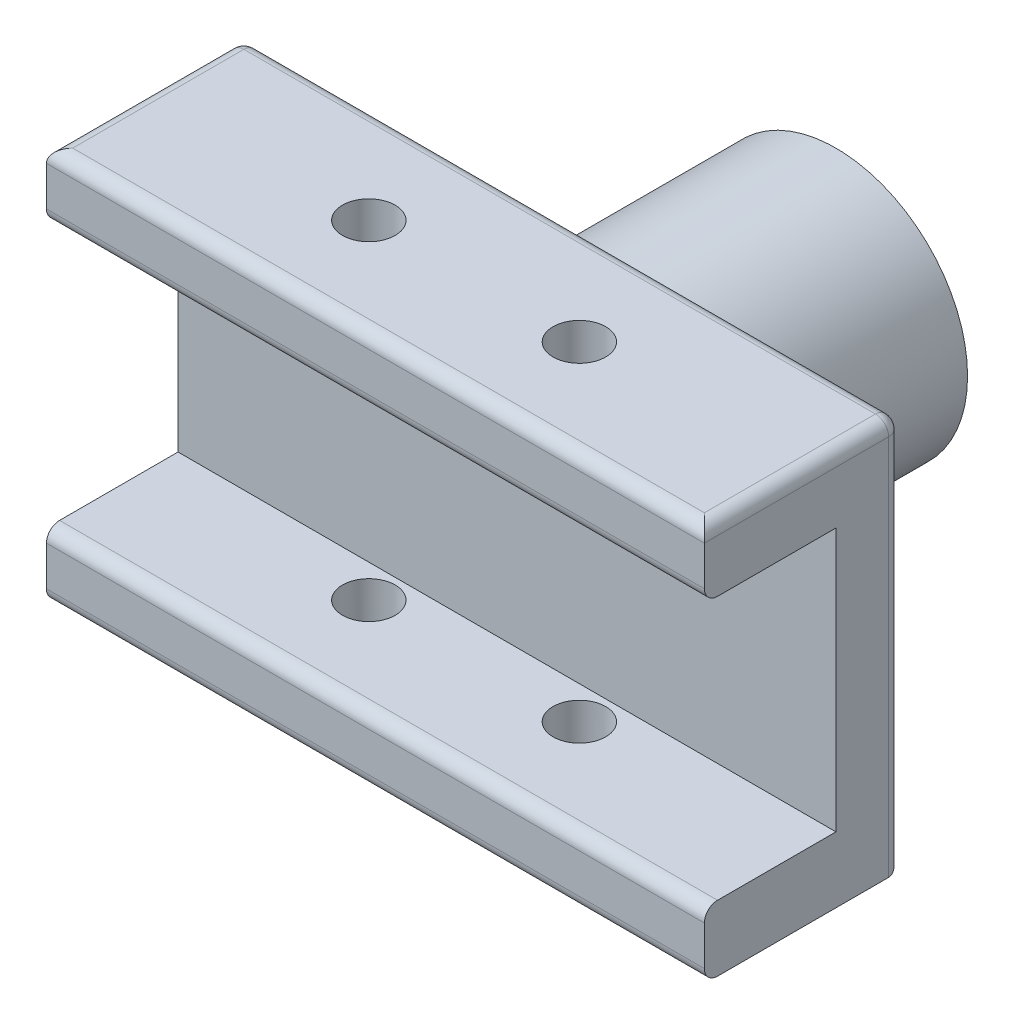
ISO-10303-21;
HEADER;
FILE_DESCRIPTION(('STEP AP214'),'2;1');
FILE_NAME('part.step','',(''),(''),'','','');
FILE_SCHEMA(('AUTOMOTIVE_DESIGN { 1 0 10303 214 1 1 1 1 }'));
ENDSEC;
DATA;
#1=APPLICATION_CONTEXT('core data for automotive mechanical design processes');
#2=APPLICATION_PROTOCOL_DEFINITION('international standard','automotive_design',2000,#1);
#3=PRODUCT_CONTEXT('',#1,'mechanical');
#4=PRODUCT('Part','Part','',(#3));
#5=PRODUCT_RELATED_PRODUCT_CATEGORY('part','',(#4));
#6=PRODUCT_DEFINITION_FORMATION('','',#4);
#7=PRODUCT_DEFINITION_CONTEXT('part definition',#1,'design');
#8=PRODUCT_DEFINITION('design','',#6,#7);
#9=PRODUCT_DEFINITION_SHAPE('','',#8);
#10=(LENGTH_UNIT() NAMED_UNIT(*) SI_UNIT(.MILLI.,.METRE.));
#11=(NAMED_UNIT(*) PLANE_ANGLE_UNIT() SI_UNIT($,.RADIAN.));
#12=(NAMED_UNIT(*) SI_UNIT($,.STERADIAN.) SOLID_ANGLE_UNIT());
#13=UNCERTAINTY_MEASURE_WITH_UNIT(LENGTH_MEASURE(1.E-05),#10,'distance_accuracy_value','');
#14=(GEOMETRIC_REPRESENTATION_CONTEXT(3) GLOBAL_UNCERTAINTY_ASSIGNED_CONTEXT((#13)) GLOBAL_UNIT_ASSIGNED_CONTEXT((#10,
#11,#12)) REPRESENTATION_CONTEXT('',''));
#15=CARTESIAN_POINT('',(0.,0.,0.));
#16=DIRECTION('',(0.,0.,1.));
#17=DIRECTION('',(1.,0.,0.));
#18=AXIS2_PLACEMENT_3D('',#15,#16,#17);
#19=CARTESIAN_POINT('',(0.,0.,15.));
#20=DIRECTION('',(0.,0.,1.));
#21=DIRECTION('',(1.,0.,0.));
#22=AXIS2_PLACEMENT_3D('',#19,#20,#21);
#23=PLANE('',#22);
#24=DIRECTION('',(0.,-1.,0.));
#25=VECTOR('',#24,1.);
#26=CARTESIAN_POINT('',(-25.,15.,15.));
#27=LINE('',#26,#25);
#28=CARTESIAN_POINT('',(-25.,-11.,15.));
#29=VERTEX_POINT('',#28);
#30=CARTESIAN_POINT('',(-25.,-14.,15.));
#31=VERTEX_POINT('',#30);
#32=EDGE_CURVE('E187',#29,#31,#27,.T.);
#33=ORIENTED_EDGE('',*,*,#32,.T.);
#34=DIRECTION('',(1.,0.,0.));
#35=VECTOR('',#34,1.);
#36=CARTESIAN_POINT('',(25.,-14.,15.));
#37=LINE('',#36,#35);
#38=CARTESIAN_POINT('',(25.,-14.,15.));
#39=VERTEX_POINT('',#38);
#40=EDGE_CURVE('E224',#31,#39,#37,.T.);
#41=ORIENTED_EDGE('',*,*,#40,.T.);
#42=DIRECTION('',(0.,1.,0.));
#43=VECTOR('',#42,1.);
#44=CARTESIAN_POINT('',(25.,15.,15.));
#45=LINE('',#44,#43);
#46=CARTESIAN_POINT('',(25.,-11.,15.));
#47=VERTEX_POINT('',#46);
#48=EDGE_CURVE('E184',#39,#47,#45,.T.);
#49=ORIENTED_EDGE('',*,*,#48,.T.);
#50=DIRECTION('',(1.,0.,0.));
#51=VECTOR('',#50,1.);
#52=CARTESIAN_POINT('',(-25.,-11.,15.));
#53=LINE('',#52,#51);
#54=EDGE_CURVE('E218',#47,#29,#53,.F.);
#55=ORIENTED_EDGE('',*,*,#54,.T.);
#56=EDGE_LOOP('',(#33,#41,#49,#55));
#57=FACE_BOUND('',#56,.T.);
#58=ADVANCED_FACE('F39',(#57),#23,.T.);
#59=CARTESIAN_POINT('',(25.,15.,15.));
#60=DIRECTION('',(-1.,0.,0.));
#61=DIRECTION('',(0.,-1.,0.));
#62=AXIS2_PLACEMENT_3D('',#59,#60,#61);
#63=PLANE('',#62);
#64=CARTESIAN_POINT('',(25.,11.,15.));
#65=VERTEX_POINT('',#64);
#66=CARTESIAN_POINT('',(25.,14.,15.));
#67=VERTEX_POINT('',#66);
#68=EDGE_CURVE('E188',#65,#67,#45,.T.);
#69=ORIENTED_EDGE('',*,*,#68,.F.);
#70=CARTESIAN_POINT('',(25.,11.,14.));
#71=DIRECTION('',(-1.,0.,0.));
#72=DIRECTION('',(0.,-1.,0.));
#73=AXIS2_PLACEMENT_3D('',#70,#71,#72);
#74=CIRCLE('',#73,1.);
#75=CARTESIAN_POINT('',(25.,10.,14.));
#76=VERTEX_POINT('',#75);
#77=EDGE_CURVE('E174',#65,#76,#74,.F.);
#78=ORIENTED_EDGE('',*,*,#77,.T.);
#79=DIRECTION('',(0.,0.,1.));
#80=VECTOR('',#79,1.);
#81=CARTESIAN_POINT('',(25.,10.,5.));
#82=LINE('',#81,#80);
#83=CARTESIAN_POINT('',(25.,10.,5.));
#84=VERTEX_POINT('',#83);
#85=EDGE_CURVE('E153',#84,#76,#82,.T.);
#86=ORIENTED_EDGE('',*,*,#85,.F.);
#87=DIRECTION('',(0.,1.,0.));
#88=VECTOR('',#87,1.);
#89=CARTESIAN_POINT('',(25.,10.,5.));
#90=LINE('',#89,#88);
#91=CARTESIAN_POINT('',(25.,-10.,5.));
#92=VERTEX_POINT('',#91);
#93=EDGE_CURVE('E160',#92,#84,#90,.T.);
#94=ORIENTED_EDGE('',*,*,#93,.F.);
#95=DIRECTION('',(0.,0.,1.));
#96=VECTOR('',#95,1.);
#97=CARTESIAN_POINT('',(25.,-10.,5.));
#98=LINE('',#97,#96);
#99=CARTESIAN_POINT('',(25.,-10.,14.));
#100=VERTEX_POINT('',#99);
#101=EDGE_CURVE('E376',#92,#100,#98,.T.);
#102=ORIENTED_EDGE('',*,*,#101,.T.);
#103=CARTESIAN_POINT('',(25.,-11.,14.));
#104=DIRECTION('',(-1.,0.,0.));
#105=DIRECTION('',(0.,-1.,0.));
#106=AXIS2_PLACEMENT_3D('',#103,#104,#105);
#107=CIRCLE('',#106,1.);
#108=EDGE_CURVE('E214',#100,#47,#107,.F.);
#109=ORIENTED_EDGE('',*,*,#108,.T.);
#110=ORIENTED_EDGE('',*,*,#48,.F.);
#111=CARTESIAN_POINT('',(25.,-14.,14.));
#112=DIRECTION('',(-1.,0.,0.));
#113=DIRECTION('',(0.,-1.,0.));
#114=AXIS2_PLACEMENT_3D('',#111,#112,#113);
#115=CIRCLE('',#114,1.);
#116=CARTESIAN_POINT('',(25.,-15.,14.));
#117=VERTEX_POINT('',#116);
#118=EDGE_CURVE('E228',#39,#117,#115,.F.);
#119=ORIENTED_EDGE('',*,*,#118,.T.);
#120=DIRECTION('',(0.,0.,-1.));
#121=VECTOR('',#120,1.);
#122=CARTESIAN_POINT('',(25.,-15.,15.));
#123=LINE('',#122,#121);
#124=CARTESIAN_POINT('',(25.,-15.,1.));
#125=VERTEX_POINT('',#124);
#126=EDGE_CURVE('E192',#117,#125,#123,.T.);
#127=ORIENTED_EDGE('',*,*,#126,.T.);
#128=DIRECTION('',(0.,1.,0.));
#129=VECTOR('',#128,1.);
#130=CARTESIAN_POINT('',(25.,15.,1.));
#131=LINE('',#130,#129);
#132=CARTESIAN_POINT('',(25.,14.,1.));
#133=VERTEX_POINT('',#132);
#134=EDGE_CURVE('E277',#125,#133,#131,.T.);
#135=ORIENTED_EDGE('',*,*,#134,.T.);
#136=DIRECTION('',(0.,0.,-1.));
#137=VECTOR('',#136,1.);
#138=CARTESIAN_POINT('',(25.,14.,15.));
#139=LINE('',#138,#137);
#140=EDGE_CURVE('E273',#133,#67,#139,.F.);
#141=ORIENTED_EDGE('',*,*,#140,.T.);
#142=EDGE_LOOP('',(#69,#78,#86,#94,#102,#109,#110,#119,#127,#135,#141));
#143=FACE_BOUND('',#142,.T.);
#144=ADVANCED_FACE('F172',(#143),#63,.F.);
#145=CARTESIAN_POINT('',(-25.,15.,15.));
#146=DIRECTION('',(0.,-1.,0.));
#147=DIRECTION('',(0.,0.,-1.));
#148=AXIS2_PLACEMENT_3D('',#145,#146,#147);
#149=PLANE('',#148);
#150=DIRECTION('',(0.,0.,-1.));
#151=VECTOR('',#150,1.);
#152=CARTESIAN_POINT('',(24.,15.,15.));
#153=LINE('',#152,#151);
#154=CARTESIAN_POINT('',(24.,15.,14.));
#155=VERTEX_POINT('',#154);
#156=CARTESIAN_POINT('',(24.,15.,1.));
#157=VERTEX_POINT('',#156);
#158=EDGE_CURVE('E240',#155,#157,#153,.T.);
#159=ORIENTED_EDGE('',*,*,#158,.T.);
#160=DIRECTION('',(-1.,0.,0.));
#161=VECTOR('',#160,1.);
#162=CARTESIAN_POINT('',(-25.,15.,1.));
#163=LINE('',#162,#161);
#164=CARTESIAN_POINT('',(-24.,15.,1.));
#165=VERTEX_POINT('',#164);
#166=EDGE_CURVE('E246',#157,#165,#163,.T.);
#167=ORIENTED_EDGE('',*,*,#166,.T.);
#168=DIRECTION('',(0.,0.,-1.));
#169=VECTOR('',#168,1.);
#170=CARTESIAN_POINT('',(-24.,15.,15.));
#171=LINE('',#170,#169);
#172=CARTESIAN_POINT('',(-24.,15.,14.));
#173=VERTEX_POINT('',#172);
#174=EDGE_CURVE('E243',#165,#173,#171,.F.);
#175=ORIENTED_EDGE('',*,*,#174,.T.);
#176=DIRECTION('',(-1.,0.,0.));
#177=VECTOR('',#176,1.);
#178=CARTESIAN_POINT('',(25.,15.,14.));
#179=LINE('',#178,#177);
#180=EDGE_CURVE('E237',#173,#155,#179,.F.);
#181=ORIENTED_EDGE('',*,*,#180,.T.);
#182=EDGE_LOOP('',(#159,#167,#175,#181));
#183=FACE_BOUND('',#182,.T.);
#184=CARTESIAN_POINT('',(-8.,15.,7.49999999999999));
#185=DIRECTION('',(0.,1.,0.));
#186=DIRECTION('',(0.,0.,1.));
#187=AXIS2_PLACEMENT_3D('',#184,#185,#186);
#188=CIRCLE('',#187,2.);
#189=CARTESIAN_POINT('',(-8.,15.,9.49999999999999));
#190=VERTEX_POINT('',#189);
#191=EDGE_CURVE('E465',#190,#190,#188,.T.);
#192=ORIENTED_EDGE('',*,*,#191,.F.);
#193=EDGE_LOOP('',(#192));
#194=FACE_BOUND('',#193,.T.);
#195=CARTESIAN_POINT('',(8.,15.,7.49999999999999));
#196=DIRECTION('',(0.,1.,0.));
#197=DIRECTION('',(0.,0.,1.));
#198=AXIS2_PLACEMENT_3D('',#195,#196,#197);
#199=CIRCLE('',#198,2.);
#200=CARTESIAN_POINT('',(8.,15.,9.49999999999999));
#201=VERTEX_POINT('',#200);
#202=EDGE_CURVE('E468',#201,#201,#199,.T.);
#203=ORIENTED_EDGE('',*,*,#202,.F.);
#204=EDGE_LOOP('',(#203));
#205=FACE_BOUND('',#204,.T.);
#206=ADVANCED_FACE('F352',(#183,#194,#205),#149,.F.);
#207=CARTESIAN_POINT('',(-25.,15.,15.));
#208=DIRECTION('',(1.,0.,0.));
#209=DIRECTION('',(0.,1.,0.));
#210=AXIS2_PLACEMENT_3D('',#207,#208,#209);
#211=PLANE('',#210);
#212=DIRECTION('',(0.,0.,1.));
#213=VECTOR('',#212,1.);
#214=CARTESIAN_POINT('',(-25.,10.,5.));
#215=LINE('',#214,#213);
#216=CARTESIAN_POINT('',(-25.,10.,5.));
#217=VERTEX_POINT('',#216);
#218=CARTESIAN_POINT('',(-25.,10.,14.));
#219=VERTEX_POINT('',#218);
#220=EDGE_CURVE('E155',#217,#219,#215,.T.);
#221=ORIENTED_EDGE('',*,*,#220,.T.);
#222=CARTESIAN_POINT('',(-25.,11.,14.));
#223=DIRECTION('',(1.,0.,0.));
#224=DIRECTION('',(0.,1.,0.));
#225=AXIS2_PLACEMENT_3D('',#222,#223,#224);
#226=CIRCLE('',#225,1.);
#227=CARTESIAN_POINT('',(-25.,11.,15.));
#228=VERTEX_POINT('',#227);
#229=EDGE_CURVE('E63',#219,#228,#226,.F.);
#230=ORIENTED_EDGE('',*,*,#229,.T.);
#231=CARTESIAN_POINT('',(-25.,14.,15.));
#232=VERTEX_POINT('',#231);
#233=EDGE_CURVE('E189',#232,#228,#27,.T.);
#234=ORIENTED_EDGE('',*,*,#233,.F.);
#235=DIRECTION('',(0.,0.,-1.));
#236=VECTOR('',#235,1.);
#237=CARTESIAN_POINT('',(-25.,14.,15.));
#238=LINE('',#237,#236);
#239=CARTESIAN_POINT('',(-25.,14.,1.));
#240=VERTEX_POINT('',#239);
#241=EDGE_CURVE('E263',#232,#240,#238,.T.);
#242=ORIENTED_EDGE('',*,*,#241,.T.);
#243=DIRECTION('',(0.,-1.,0.));
#244=VECTOR('',#243,1.);
#245=CARTESIAN_POINT('',(-25.,15.,1.));
#246=LINE('',#245,#244);
#247=CARTESIAN_POINT('',(-25.,-15.,1.));
#248=VERTEX_POINT('',#247);
#249=EDGE_CURVE('E266',#240,#248,#246,.T.);
#250=ORIENTED_EDGE('',*,*,#249,.T.);
#251=DIRECTION('',(0.,0.,-1.));
#252=VECTOR('',#251,1.);
#253=CARTESIAN_POINT('',(-25.,-15.,15.));
#254=LINE('',#253,#252);
#255=CARTESIAN_POINT('',(-25.,-15.,14.));
#256=VERTEX_POINT('',#255);
#257=EDGE_CURVE('E196',#256,#248,#254,.T.);
#258=ORIENTED_EDGE('',*,*,#257,.F.);
#259=CARTESIAN_POINT('',(-25.,-14.,14.));
#260=DIRECTION('',(1.,0.,0.));
#261=DIRECTION('',(0.,1.,0.));
#262=AXIS2_PLACEMENT_3D('',#259,#260,#261);
#263=CIRCLE('',#262,1.);
#264=EDGE_CURVE('E234',#256,#31,#263,.F.);
#265=ORIENTED_EDGE('',*,*,#264,.T.);
#266=ORIENTED_EDGE('',*,*,#32,.F.);
#267=CARTESIAN_POINT('',(-25.,-11.,14.));
#268=DIRECTION('',(1.,0.,0.));
#269=DIRECTION('',(0.,1.,0.));
#270=AXIS2_PLACEMENT_3D('',#267,#268,#269);
#271=CIRCLE('',#270,1.);
#272=CARTESIAN_POINT('',(-25.,-10.,14.));
#273=VERTEX_POINT('',#272);
#274=EDGE_CURVE('E221',#29,#273,#271,.F.);
#275=ORIENTED_EDGE('',*,*,#274,.T.);
#276=DIRECTION('',(0.,0.,1.));
#277=VECTOR('',#276,1.);
#278=CARTESIAN_POINT('',(-25.,-10.,5.));
#279=LINE('',#278,#277);
#280=CARTESIAN_POINT('',(-25.,-10.,5.));
#281=VERTEX_POINT('',#280);
#282=EDGE_CURVE('E179',#281,#273,#279,.T.);
#283=ORIENTED_EDGE('',*,*,#282,.F.);
#284=DIRECTION('',(0.,-1.,0.));
#285=VECTOR('',#284,1.);
#286=CARTESIAN_POINT('',(-25.,10.,5.));
#287=LINE('',#286,#285);
#288=EDGE_CURVE('E159',#217,#281,#287,.T.);
#289=ORIENTED_EDGE('',*,*,#288,.F.);
#290=EDGE_LOOP('',(#221,#230,#234,#242,#250,#258,#265,#266,#275,#283,#289));
#291=FACE_BOUND('',#290,.T.);
#292=ADVANCED_FACE('F366',(#291),#211,.F.);
#293=CARTESIAN_POINT('',(-25.,-15.,15.));
#294=DIRECTION('',(0.,1.,0.));
#295=DIRECTION('',(0.,0.,1.));
#296=AXIS2_PLACEMENT_3D('',#293,#294,#295);
#297=PLANE('',#296);
#298=CARTESIAN_POINT('',(-8.,-15.,7.49999999999999));
#299=DIRECTION('',(0.,1.,0.));
#300=DIRECTION('',(0.,0.,1.));
#301=AXIS2_PLACEMENT_3D('',#298,#299,#300);
#302=CIRCLE('',#301,2.);
#303=CARTESIAN_POINT('',(-8.,-15.,9.49999999999999));
#304=VERTEX_POINT('',#303);
#305=EDGE_CURVE('E206',#304,#304,#302,.T.);
#306=ORIENTED_EDGE('',*,*,#305,.T.);
#307=EDGE_LOOP('',(#306));
#308=FACE_BOUND('',#307,.T.);
#309=CARTESIAN_POINT('',(8.,-15.,7.49999999999999));
#310=DIRECTION('',(0.,1.,0.));
#311=DIRECTION('',(0.,0.,1.));
#312=AXIS2_PLACEMENT_3D('',#309,#310,#311);
#313=CIRCLE('',#312,2.);
#314=CARTESIAN_POINT('',(8.,-15.,9.49999999999999));
#315=VERTEX_POINT('',#314);
#316=EDGE_CURVE('E471',#315,#315,#313,.T.);
#317=ORIENTED_EDGE('',*,*,#316,.T.);
#318=EDGE_LOOP('',(#317));
#319=FACE_BOUND('',#318,.T.);
#320=ORIENTED_EDGE('',*,*,#257,.T.);
#321=DIRECTION('',(1.,0.,0.));
#322=VECTOR('',#321,1.);
#323=CARTESIAN_POINT('',(-25.,-15.,1.));
#324=LINE('',#323,#322);
#325=EDGE_CURVE('E270',#248,#125,#324,.T.);
#326=ORIENTED_EDGE('',*,*,#325,.T.);
#327=ORIENTED_EDGE('',*,*,#126,.F.);
#328=DIRECTION('',(1.,0.,0.));
#329=VECTOR('',#328,1.);
#330=CARTESIAN_POINT('',(-25.,-15.,14.));
#331=LINE('',#330,#329);
#332=EDGE_CURVE('E231',#117,#256,#331,.F.);
#333=ORIENTED_EDGE('',*,*,#332,.T.);
#334=EDGE_LOOP('',(#320,#326,#327,#333));
#335=FACE_BOUND('',#334,.T.);
#336=ADVANCED_FACE('F359',(#308,#319,#335),#297,.F.);
#337=ORIENTED_EDGE('',*,*,#233,.T.);
#338=DIRECTION('',(-1.,0.,0.));
#339=VECTOR('',#338,1.);
#340=CARTESIAN_POINT('',(25.,11.,15.));
#341=LINE('',#340,#339);
#342=EDGE_CURVE('E55',#228,#65,#341,.F.);
#343=ORIENTED_EDGE('',*,*,#342,.T.);
#344=ORIENTED_EDGE('',*,*,#68,.T.);
#345=DIRECTION('',(-1.,0.,0.));
#346=VECTOR('',#345,1.);
#347=CARTESIAN_POINT('',(-25.,14.,15.));
#348=LINE('',#347,#346);
#349=EDGE_CURVE('E280',#67,#232,#348,.T.);
#350=ORIENTED_EDGE('',*,*,#349,.T.);
#351=EDGE_LOOP('',(#337,#343,#344,#350));
#352=FACE_BOUND('',#351,.T.);
#353=ADVANCED_FACE('F348',(#352),#23,.T.);
#354=CARTESIAN_POINT('',(0.,0.,0.));
#355=DIRECTION('',(0.,0.,1.));
#356=DIRECTION('',(1.,0.,0.));
#357=AXIS2_PLACEMENT_3D('',#354,#355,#356);
#358=PLANE('',#357);
#359=CARTESIAN_POINT('',(0.,0.,0.));
#360=DIRECTION('',(0.,0.,1.));
#361=DIRECTION('',(1.,0.,0.));
#362=AXIS2_PLACEMENT_3D('',#359,#360,#361);
#363=CIRCLE('',#362,11.);
#364=CARTESIAN_POINT('',(11.,0.,0.));
#365=VERTEX_POINT('',#364);
#366=EDGE_CURVE('E11',#365,#365,#363,.T.);
#367=ORIENTED_EDGE('',*,*,#366,.T.);
#368=EDGE_LOOP('',(#367));
#369=FACE_BOUND('',#368,.T.);
#370=DIRECTION('',(0.,-1.,0.));
#371=VECTOR('',#370,1.);
#372=CARTESIAN_POINT('',(-24.,0.,0.));
#373=LINE('',#372,#371);
#374=CARTESIAN_POINT('',(-24.,-14.,0.));
#375=VERTEX_POINT('',#374);
#376=CARTESIAN_POINT('',(-24.,14.,0.));
#377=VERTEX_POINT('',#376);
#378=EDGE_CURVE('E256',#375,#377,#373,.F.);
#379=ORIENTED_EDGE('',*,*,#378,.T.);
#380=DIRECTION('',(-1.,0.,0.));
#381=VECTOR('',#380,1.);
#382=CARTESIAN_POINT('',(0.,14.,0.));
#383=LINE('',#382,#381);
#384=CARTESIAN_POINT('',(24.,14.,0.));
#385=VERTEX_POINT('',#384);
#386=EDGE_CURVE('E259',#377,#385,#383,.F.);
#387=ORIENTED_EDGE('',*,*,#386,.T.);
#388=DIRECTION('',(0.,1.,0.));
#389=VECTOR('',#388,1.);
#390=CARTESIAN_POINT('',(24.,0.,0.));
#391=LINE('',#390,#389);
#392=CARTESIAN_POINT('',(24.,-14.,0.));
#393=VERTEX_POINT('',#392);
#394=EDGE_CURVE('E250',#385,#393,#391,.F.);
#395=ORIENTED_EDGE('',*,*,#394,.T.);
#396=DIRECTION('',(1.,0.,0.));
#397=VECTOR('',#396,1.);
#398=CARTESIAN_POINT('',(0.,-14.,0.));
#399=LINE('',#398,#397);
#400=EDGE_CURVE('E253',#393,#375,#399,.F.);
#401=ORIENTED_EDGE('',*,*,#400,.T.);
#402=EDGE_LOOP('',(#379,#387,#395,#401));
#403=FACE_BOUND('',#402,.T.);
#404=ADVANCED_FACE('F358',(#369,#403),#358,.F.);
#405=CARTESIAN_POINT('',(-25.,-10.,5.));
#406=DIRECTION('',(0.,-1.,0.));
#407=DIRECTION('',(0.,0.,-1.));
#408=AXIS2_PLACEMENT_3D('',#405,#406,#407);
#409=PLANE('',#408);
#410=CARTESIAN_POINT('',(-8.,-10.,7.49999999999999));
#411=DIRECTION('',(0.,-1.,0.));
#412=DIRECTION('',(0.,0.,-1.));
#413=AXIS2_PLACEMENT_3D('',#410,#411,#412);
#414=CIRCLE('',#413,2.);
#415=CARTESIAN_POINT('',(-8.,-10.,5.49999999999999));
#416=VERTEX_POINT('',#415);
#417=EDGE_CURVE('E170',#416,#416,#414,.T.);
#418=ORIENTED_EDGE('',*,*,#417,.T.);
#419=EDGE_LOOP('',(#418));
#420=FACE_BOUND('',#419,.T.);
#421=CARTESIAN_POINT('',(8.,-10.,7.49999999999999));
#422=DIRECTION('',(0.,-1.,0.));
#423=DIRECTION('',(0.,0.,-1.));
#424=AXIS2_PLACEMENT_3D('',#421,#422,#423);
#425=CIRCLE('',#424,2.);
#426=CARTESIAN_POINT('',(8.,-10.,5.49999999999999));
#427=VERTEX_POINT('',#426);
#428=EDGE_CURVE('E205',#427,#427,#425,.T.);
#429=ORIENTED_EDGE('',*,*,#428,.T.);
#430=EDGE_LOOP('',(#429));
#431=FACE_BOUND('',#430,.T.);
#432=ORIENTED_EDGE('',*,*,#282,.T.);
#433=DIRECTION('',(1.,0.,0.));
#434=VECTOR('',#433,1.);
#435=CARTESIAN_POINT('',(25.,-10.,14.));
#436=LINE('',#435,#434);
#437=EDGE_CURVE('E200',#273,#100,#436,.T.);
#438=ORIENTED_EDGE('',*,*,#437,.T.);
#439=ORIENTED_EDGE('',*,*,#101,.F.);
#440=DIRECTION('',(1.,0.,0.));
#441=VECTOR('',#440,1.);
#442=CARTESIAN_POINT('',(-25.,-10.,5.));
#443=LINE('',#442,#441);
#444=EDGE_CURVE('E166',#281,#92,#443,.T.);
#445=ORIENTED_EDGE('',*,*,#444,.F.);
#446=EDGE_LOOP('',(#432,#438,#439,#445));
#447=FACE_BOUND('',#446,.T.);
#448=ADVANCED_FACE('F364',(#420,#431,#447),#409,.F.);
#449=CARTESIAN_POINT('',(-25.,10.,5.));
#450=DIRECTION('',(0.,1.,0.));
#451=DIRECTION('',(0.,0.,1.));
#452=AXIS2_PLACEMENT_3D('',#449,#450,#451);
#453=PLANE('',#452);
#454=CARTESIAN_POINT('',(-8.,10.,7.49999999999999));
#455=DIRECTION('',(0.,1.,0.));
#456=DIRECTION('',(0.,0.,1.));
#457=AXIS2_PLACEMENT_3D('',#454,#455,#456);
#458=CIRCLE('',#457,2.);
#459=CARTESIAN_POINT('',(-8.,10.,9.49999999999999));
#460=VERTEX_POINT('',#459);
#461=EDGE_CURVE('E207',#460,#460,#458,.T.);
#462=ORIENTED_EDGE('',*,*,#461,.T.);
#463=EDGE_LOOP('',(#462));
#464=FACE_BOUND('',#463,.T.);
#465=CARTESIAN_POINT('',(8.,10.,7.49999999999999));
#466=DIRECTION('',(0.,1.,0.));
#467=DIRECTION('',(0.,0.,1.));
#468=AXIS2_PLACEMENT_3D('',#465,#466,#467);
#469=CIRCLE('',#468,2.);
#470=CARTESIAN_POINT('',(8.,10.,9.49999999999999));
#471=VERTEX_POINT('',#470);
#472=EDGE_CURVE('E201',#471,#471,#469,.T.);
#473=ORIENTED_EDGE('',*,*,#472,.T.);
#474=EDGE_LOOP('',(#473));
#475=FACE_BOUND('',#474,.T.);
#476=ORIENTED_EDGE('',*,*,#85,.T.);
#477=DIRECTION('',(-1.,0.,0.));
#478=VECTOR('',#477,1.);
#479=CARTESIAN_POINT('',(-25.,10.,14.));
#480=LINE('',#479,#478);
#481=EDGE_CURVE('E283',#76,#219,#480,.T.);
#482=ORIENTED_EDGE('',*,*,#481,.T.);
#483=ORIENTED_EDGE('',*,*,#220,.F.);
#484=DIRECTION('',(-1.,0.,0.));
#485=VECTOR('',#484,1.);
#486=CARTESIAN_POINT('',(-25.,10.,5.));
#487=LINE('',#486,#485);
#488=EDGE_CURVE('E148',#84,#217,#487,.T.);
#489=ORIENTED_EDGE('',*,*,#488,.F.);
#490=EDGE_LOOP('',(#476,#482,#483,#489));
#491=FACE_BOUND('',#490,.T.);
#492=ADVANCED_FACE('F150',(#464,#475,#491),#453,.F.);
#493=CARTESIAN_POINT('',(0.,0.,5.));
#494=DIRECTION('',(0.,0.,1.));
#495=DIRECTION('',(1.,0.,0.));
#496=AXIS2_PLACEMENT_3D('',#493,#494,#495);
#497=PLANE('',#496);
#498=ORIENTED_EDGE('',*,*,#93,.T.);
#499=ORIENTED_EDGE('',*,*,#488,.T.);
#500=ORIENTED_EDGE('',*,*,#288,.T.);
#501=ORIENTED_EDGE('',*,*,#444,.T.);
#502=EDGE_LOOP('',(#498,#499,#500,#501));
#503=FACE_BOUND('',#502,.T.);
#504=ADVANCED_FACE('F164',(#503),#497,.T.);
#505=CARTESIAN_POINT('',(8.,-15.,7.49999999999999));
#506=DIRECTION('',(0.,1.,0.));
#507=DIRECTION('',(0.,0.,1.));
#508=AXIS2_PLACEMENT_3D('',#505,#506,#507);
#509=CYLINDRICAL_SURFACE('',#508,2.);
#510=ORIENTED_EDGE('',*,*,#202,.T.);
#511=EDGE_LOOP('',(#510));
#512=FACE_BOUND('',#511,.T.);
#513=ORIENTED_EDGE('',*,*,#472,.F.);
#514=EDGE_LOOP('',(#513));
#515=FACE_BOUND('',#514,.T.);
#516=ADVANCED_FACE('F504',(#512,#515),#509,.F.);
#517=CARTESIAN_POINT('',(-8.,-15.,7.49999999999999));
#518=DIRECTION('',(0.,1.,0.));
#519=DIRECTION('',(0.,0.,1.));
#520=AXIS2_PLACEMENT_3D('',#517,#518,#519);
#521=CYLINDRICAL_SURFACE('',#520,2.);
#522=ORIENTED_EDGE('',*,*,#191,.T.);
#523=EDGE_LOOP('',(#522));
#524=FACE_BOUND('',#523,.T.);
#525=ORIENTED_EDGE('',*,*,#461,.F.);
#526=EDGE_LOOP('',(#525));
#527=FACE_BOUND('',#526,.T.);
#528=ADVANCED_FACE('F495',(#524,#527),#521,.F.);
#529=ORIENTED_EDGE('',*,*,#316,.F.);
#530=EDGE_LOOP('',(#529));
#531=FACE_BOUND('',#530,.T.);
#532=ORIENTED_EDGE('',*,*,#428,.F.);
#533=EDGE_LOOP('',(#532));
#534=FACE_BOUND('',#533,.T.);
#535=ADVANCED_FACE('F492',(#531,#534),#509,.F.);
#536=ORIENTED_EDGE('',*,*,#305,.F.);
#537=EDGE_LOOP('',(#536));
#538=FACE_BOUND('',#537,.T.);
#539=ORIENTED_EDGE('',*,*,#417,.F.);
#540=EDGE_LOOP('',(#539));
#541=FACE_BOUND('',#540,.T.);
#542=ADVANCED_FACE('F490',(#538,#541),#521,.F.);
#543=CARTESIAN_POINT('',(0.,0.,-20.));
#544=DIRECTION('',(0.,0.,1.));
#545=DIRECTION('',(1.,0.,0.));
#546=AXIS2_PLACEMENT_3D('',#543,#544,#545);
#547=CYLINDRICAL_SURFACE('',#546,10.);
#548=CARTESIAN_POINT('',(0.,0.,-1.));
#549=DIRECTION('',(0.,0.,1.));
#550=DIRECTION('',(1.,0.,0.));
#551=AXIS2_PLACEMENT_3D('',#548,#549,#550);
#552=CIRCLE('',#551,10.);
#553=CARTESIAN_POINT('',(10.,0.,-1.));
#554=VERTEX_POINT('',#553);
#555=EDGE_CURVE('E48',#554,#554,#552,.F.);
#556=ORIENTED_EDGE('',*,*,#555,.T.);
#557=EDGE_LOOP('',(#556));
#558=FACE_BOUND('',#557,.T.);
#559=CARTESIAN_POINT('',(0.,0.,-20.));
#560=DIRECTION('',(0.,0.,-1.));
#561=DIRECTION('',(-1.,0.,0.));
#562=AXIS2_PLACEMENT_3D('',#559,#560,#561);
#563=CIRCLE('',#562,10.);
#564=CARTESIAN_POINT('',(-10.,0.,-20.));
#565=VERTEX_POINT('',#564);
#566=EDGE_CURVE('E321',#565,#565,#563,.T.);
#567=ORIENTED_EDGE('',*,*,#566,.F.);
#568=EDGE_LOOP('',(#567));
#569=FACE_BOUND('',#568,.T.);
#570=ADVANCED_FACE('F333',(#558,#569),#547,.T.);
#571=CARTESIAN_POINT('',(0.,0.,-20.));
#572=DIRECTION('',(0.,0.,-1.));
#573=DIRECTION('',(-1.,0.,0.));
#574=AXIS2_PLACEMENT_3D('',#571,#572,#573);
#575=PLANE('',#574);
#576=ORIENTED_EDGE('',*,*,#566,.T.);
#577=EDGE_LOOP('',(#576));
#578=FACE_BOUND('',#577,.T.);
#579=ADVANCED_FACE('F500',(#578),#575,.T.);
#580=CARTESIAN_POINT('',(-25.,-11.,14.));
#581=DIRECTION('',(-1.,0.,0.));
#582=DIRECTION('',(0.,0.,1.));
#583=AXIS2_PLACEMENT_3D('',#580,#581,#582);
#584=CYLINDRICAL_SURFACE('',#583,1.);
#585=ORIENTED_EDGE('',*,*,#274,.F.);
#586=ORIENTED_EDGE('',*,*,#54,.F.);
#587=ORIENTED_EDGE('',*,*,#108,.F.);
#588=ORIENTED_EDGE('',*,*,#437,.F.);
#589=EDGE_LOOP('',(#585,#586,#587,#588));
#590=FACE_BOUND('',#589,.T.);
#591=ADVANCED_FACE('F383',(#590),#584,.T.);
#592=CARTESIAN_POINT('',(0.,-14.,14.));
#593=DIRECTION('',(-1.,0.,0.));
#594=DIRECTION('',(0.,0.,1.));
#595=AXIS2_PLACEMENT_3D('',#592,#593,#594);
#596=CYLINDRICAL_SURFACE('',#595,1.);
#597=ORIENTED_EDGE('',*,*,#264,.F.);
#598=ORIENTED_EDGE('',*,*,#332,.F.);
#599=ORIENTED_EDGE('',*,*,#118,.F.);
#600=ORIENTED_EDGE('',*,*,#40,.F.);
#601=EDGE_LOOP('',(#597,#598,#599,#600));
#602=FACE_BOUND('',#601,.T.);
#603=ADVANCED_FACE('F391',(#602),#596,.T.);
#604=CARTESIAN_POINT('',(0.,14.,14.));
#605=DIRECTION('',(1.,0.,0.));
#606=DIRECTION('',(0.,0.,-1.));
#607=AXIS2_PLACEMENT_3D('',#604,#605,#606);
#608=CYLINDRICAL_SURFACE('',#607,1.);
#609=CARTESIAN_POINT('',(-24.,14.,14.));
#610=DIRECTION('',(0.707106781186547,0.,0.707106781186547));
#611=DIRECTION('',(0.707106781186547,0.,-0.707106781186547));
#612=AXIS2_PLACEMENT_3D('',#609,#610,#611);
#613=ELLIPSE('',#612,1.41421356237309,1.);
#614=EDGE_CURVE('E309',#232,#173,#613,.F.);
#615=ORIENTED_EDGE('',*,*,#614,.F.);
#616=ORIENTED_EDGE('',*,*,#349,.F.);
#617=CARTESIAN_POINT('',(24.,14.,14.));
#618=DIRECTION('',(0.707106781186547,0.,-0.707106781186547));
#619=DIRECTION('',(0.707106781186547,0.,0.707106781186547));
#620=AXIS2_PLACEMENT_3D('',#617,#618,#619);
#621=ELLIPSE('',#620,1.41421356237309,1.);
#622=EDGE_CURVE('E313',#155,#67,#621,.T.);
#623=ORIENTED_EDGE('',*,*,#622,.F.);
#624=ORIENTED_EDGE('',*,*,#180,.F.);
#625=EDGE_LOOP('',(#615,#616,#623,#624));
#626=FACE_BOUND('',#625,.T.);
#627=ADVANCED_FACE('F450',(#626),#608,.T.);
#628=CARTESIAN_POINT('',(-25.,-14.,1.));
#629=DIRECTION('',(1.,0.,0.));
#630=DIRECTION('',(0.,0.,-1.));
#631=AXIS2_PLACEMENT_3D('',#628,#629,#630);
#632=CYLINDRICAL_SURFACE('',#631,1.);
#633=CARTESIAN_POINT('',(-24.,-14.,1.));
#634=DIRECTION('',(0.707106781186548,-0.707106781186547,0.));
#635=DIRECTION('',(0.707106781186547,0.707106781186548,0.));
#636=AXIS2_PLACEMENT_3D('',#633,#634,#635);
#637=ELLIPSE('',#636,1.41421356237309,1.);
#638=EDGE_CURVE('E306',#375,#248,#637,.F.);
#639=ORIENTED_EDGE('',*,*,#638,.F.);
#640=ORIENTED_EDGE('',*,*,#400,.F.);
#641=CARTESIAN_POINT('',(24.,-14.,1.));
#642=DIRECTION('',(0.707106781186547,0.707106781186548,0.));
#643=DIRECTION('',(-0.707106781186548,0.707106781186547,0.));
#644=AXIS2_PLACEMENT_3D('',#641,#642,#643);
#645=ELLIPSE('',#644,1.4142135623731,1.);
#646=EDGE_CURVE('E317',#125,#393,#645,.T.);
#647=ORIENTED_EDGE('',*,*,#646,.F.);
#648=ORIENTED_EDGE('',*,*,#325,.F.);
#649=EDGE_LOOP('',(#639,#640,#647,#648));
#650=FACE_BOUND('',#649,.T.);
#651=ADVANCED_FACE('F419',(#650),#632,.T.);
#652=CARTESIAN_POINT('',(24.,15.,1.));
#653=DIRECTION('',(0.,1.,0.));
#654=DIRECTION('',(-1.,0.,0.));
#655=AXIS2_PLACEMENT_3D('',#652,#653,#654);
#656=CYLINDRICAL_SURFACE('',#655,1.);
#657=ORIENTED_EDGE('',*,*,#646,.T.);
#658=ORIENTED_EDGE('',*,*,#394,.F.);
#659=CARTESIAN_POINT('',(24.,14.,1.));
#660=DIRECTION('',(0.,1.,0.));
#661=DIRECTION('',(0.,0.,1.));
#662=AXIS2_PLACEMENT_3D('',#659,#660,#661);
#663=CIRCLE('',#662,1.);
#664=EDGE_CURVE('E302',#133,#385,#663,.T.);
#665=ORIENTED_EDGE('',*,*,#664,.F.);
#666=ORIENTED_EDGE('',*,*,#134,.F.);
#667=EDGE_LOOP('',(#657,#658,#665,#666));
#668=FACE_BOUND('',#667,.T.);
#669=ADVANCED_FACE('F429',(#668),#656,.T.);
#670=CARTESIAN_POINT('',(24.,14.,15.));
#671=DIRECTION('',(0.,0.,-1.));
#672=DIRECTION('',(-1.,0.,0.));
#673=AXIS2_PLACEMENT_3D('',#670,#671,#672);
#674=CYLINDRICAL_SURFACE('',#673,1.);
#675=ORIENTED_EDGE('',*,*,#622,.T.);
#676=ORIENTED_EDGE('',*,*,#140,.F.);
#677=CARTESIAN_POINT('',(24.,14.,1.));
#678=DIRECTION('',(0.,0.,-1.));
#679=DIRECTION('',(-1.,0.,0.));
#680=AXIS2_PLACEMENT_3D('',#677,#678,#679);
#681=CIRCLE('',#680,1.);
#682=EDGE_CURVE('E298',#157,#133,#681,.T.);
#683=ORIENTED_EDGE('',*,*,#682,.F.);
#684=ORIENTED_EDGE('',*,*,#158,.F.);
#685=EDGE_LOOP('',(#675,#676,#683,#684));
#686=FACE_BOUND('',#685,.T.);
#687=ADVANCED_FACE('F426',(#686),#674,.T.);
#688=CARTESIAN_POINT('',(-24.,14.,15.));
#689=DIRECTION('',(0.,0.,-1.));
#690=DIRECTION('',(-1.,0.,0.));
#691=AXIS2_PLACEMENT_3D('',#688,#689,#690);
#692=CYLINDRICAL_SURFACE('',#691,1.);
#693=ORIENTED_EDGE('',*,*,#614,.T.);
#694=ORIENTED_EDGE('',*,*,#174,.F.);
#695=CARTESIAN_POINT('',(-24.,14.,1.));
#696=DIRECTION('',(0.,0.,-1.));
#697=DIRECTION('',(-1.,0.,0.));
#698=AXIS2_PLACEMENT_3D('',#695,#696,#697);
#699=CIRCLE('',#698,1.);
#700=EDGE_CURVE('E294',#240,#165,#699,.T.);
#701=ORIENTED_EDGE('',*,*,#700,.F.);
#702=ORIENTED_EDGE('',*,*,#241,.F.);
#703=EDGE_LOOP('',(#693,#694,#701,#702));
#704=FACE_BOUND('',#703,.T.);
#705=ADVANCED_FACE('F407',(#704),#692,.T.);
#706=CARTESIAN_POINT('',(-24.,15.,1.));
#707=DIRECTION('',(0.,-1.,0.));
#708=DIRECTION('',(1.,0.,0.));
#709=AXIS2_PLACEMENT_3D('',#706,#707,#708);
#710=CYLINDRICAL_SURFACE('',#709,1.);
#711=ORIENTED_EDGE('',*,*,#638,.T.);
#712=ORIENTED_EDGE('',*,*,#249,.F.);
#713=CARTESIAN_POINT('',(-24.,14.,1.));
#714=DIRECTION('',(0.,1.,0.));
#715=DIRECTION('',(0.,0.,1.));
#716=AXIS2_PLACEMENT_3D('',#713,#714,#715);
#717=CIRCLE('',#716,1.);
#718=EDGE_CURVE('E290',#377,#240,#717,.T.);
#719=ORIENTED_EDGE('',*,*,#718,.F.);
#720=ORIENTED_EDGE('',*,*,#378,.F.);
#721=EDGE_LOOP('',(#711,#712,#719,#720));
#722=FACE_BOUND('',#721,.T.);
#723=ADVANCED_FACE('F400',(#722),#710,.T.);
#724=CARTESIAN_POINT('',(24.,14.,1.));
#725=DIRECTION('',(1.,0.,0.));
#726=DIRECTION('',(0.,0.,-1.));
#727=AXIS2_PLACEMENT_3D('',#724,#725,#726);
#728=SPHERICAL_SURFACE('',#727,1.);
#729=ORIENTED_EDGE('',*,*,#682,.T.);
#730=ORIENTED_EDGE('',*,*,#664,.T.);
#731=CARTESIAN_POINT('',(24.,14.,1.));
#732=DIRECTION('',(1.,0.,0.));
#733=DIRECTION('',(0.,0.,-1.));
#734=AXIS2_PLACEMENT_3D('',#731,#732,#733);
#735=CIRCLE('',#734,1.);
#736=EDGE_CURVE('E287',#157,#385,#735,.F.);
#737=ORIENTED_EDGE('',*,*,#736,.F.);
#738=EDGE_LOOP('',(#729,#730,#737));
#739=FACE_BOUND('',#738,.T.);
#740=ADVANCED_FACE('F431',(#739),#728,.T.);
#741=CARTESIAN_POINT('',(-24.,14.,1.));
#742=DIRECTION('',(-1.,0.,0.));
#743=DIRECTION('',(0.,0.,1.));
#744=AXIS2_PLACEMENT_3D('',#741,#742,#743);
#745=SPHERICAL_SURFACE('',#744,1.);
#746=ORIENTED_EDGE('',*,*,#718,.T.);
#747=ORIENTED_EDGE('',*,*,#700,.T.);
#748=CARTESIAN_POINT('',(-24.,14.,1.));
#749=DIRECTION('',(-1.,0.,0.));
#750=DIRECTION('',(0.,0.,1.));
#751=AXIS2_PLACEMENT_3D('',#748,#749,#750);
#752=CIRCLE('',#751,1.);
#753=EDGE_CURVE('E284',#377,#165,#752,.F.);
#754=ORIENTED_EDGE('',*,*,#753,.F.);
#755=EDGE_LOOP('',(#746,#747,#754));
#756=FACE_BOUND('',#755,.T.);
#757=ADVANCED_FACE('F410',(#756),#745,.T.);
#758=CARTESIAN_POINT('',(-25.,14.,1.));
#759=DIRECTION('',(-1.,0.,0.));
#760=DIRECTION('',(0.,0.,1.));
#761=AXIS2_PLACEMENT_3D('',#758,#759,#760);
#762=CYLINDRICAL_SURFACE('',#761,1.);
#763=ORIENTED_EDGE('',*,*,#736,.T.);
#764=ORIENTED_EDGE('',*,*,#386,.F.);
#765=ORIENTED_EDGE('',*,*,#753,.T.);
#766=ORIENTED_EDGE('',*,*,#166,.F.);
#767=EDGE_LOOP('',(#763,#764,#765,#766));
#768=FACE_BOUND('',#767,.T.);
#769=ADVANCED_FACE('F342',(#768),#762,.T.);
#770=CARTESIAN_POINT('',(-25.,11.,14.));
#771=DIRECTION('',(1.,0.,0.));
#772=DIRECTION('',(0.,0.,-1.));
#773=AXIS2_PLACEMENT_3D('',#770,#771,#772);
#774=CYLINDRICAL_SURFACE('',#773,1.);
#775=ORIENTED_EDGE('',*,*,#77,.F.);
#776=ORIENTED_EDGE('',*,*,#342,.F.);
#777=ORIENTED_EDGE('',*,*,#229,.F.);
#778=ORIENTED_EDGE('',*,*,#481,.F.);
#779=EDGE_LOOP('',(#775,#776,#777,#778));
#780=FACE_BOUND('',#779,.T.);
#781=ADVANCED_FACE('F337',(#780),#774,.T.);
#782=CARTESIAN_POINT('',(0.,0.,-1.));
#783=DIRECTION('',(0.,0.,1.));
#784=DIRECTION('',(1.,0.,0.));
#785=AXIS2_PLACEMENT_3D('',#782,#783,#784);
#786=TOROIDAL_SURFACE('',#785,11.,1.);
#787=ORIENTED_EDGE('',*,*,#366,.F.);
#788=EDGE_LOOP('',(#787));
#789=FACE_BOUND('',#788,.T.);
#790=ORIENTED_EDGE('',*,*,#555,.F.);
#791=EDGE_LOOP('',(#790));
#792=FACE_BOUND('',#791,.T.);
#793=ADVANCED_FACE('F41',(#789,#792),#786,.F.);
#794=CLOSED_SHELL('',(#58,#144,#206,#292,#336,#353,#404,#448,#492,#504,#516,#528,#535,#542,#570,
#579,#591,#603,#627,#651,#669,#687,#705,#723,#740,#757,#769,#781,#793));
#795=MANIFOLD_SOLID_BREP('B2',#794);
#796=ADVANCED_BREP_SHAPE_REPRESENTATION('',(#18,#795),#14);
#797=SHAPE_DEFINITION_REPRESENTATION(#9,#796);
ENDSEC;
END-ISO-10303-21;
